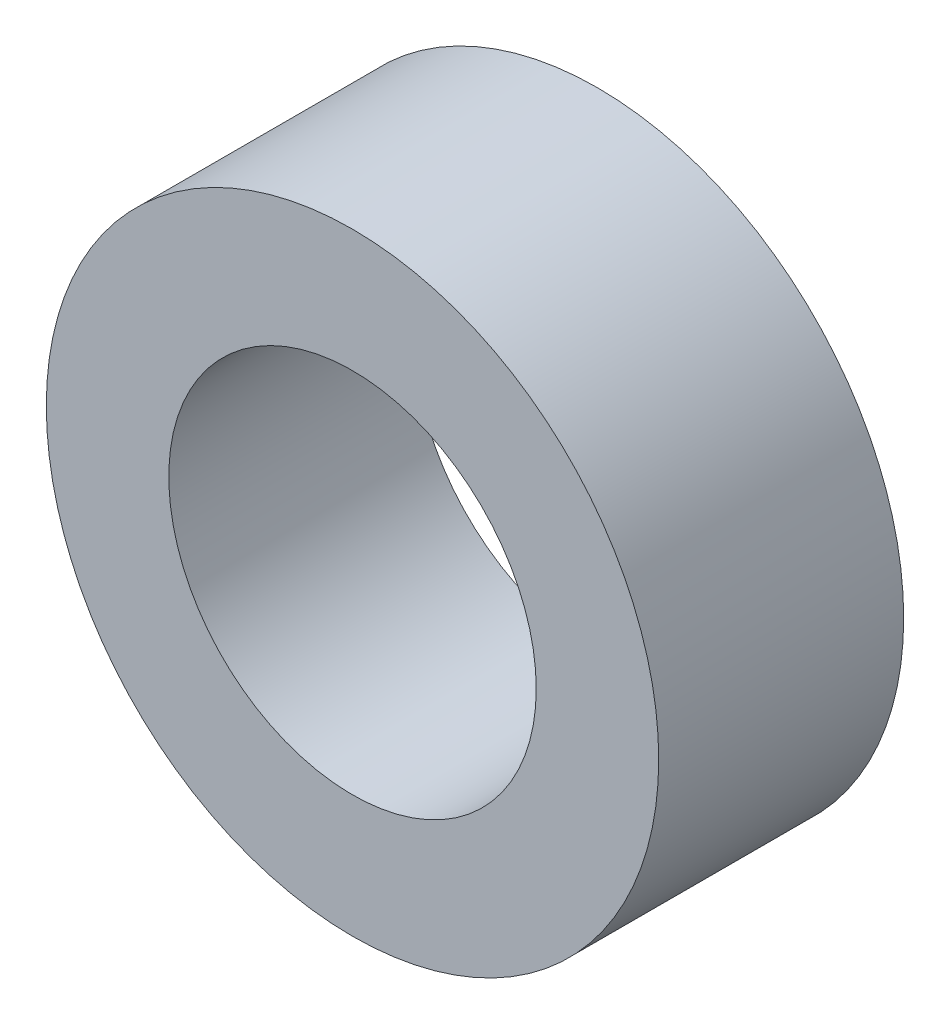
ISO-10303-21;
HEADER;
FILE_DESCRIPTION(('STEP AP214'),'2;1');
FILE_NAME('part.step','',(''),(''),'','','');
FILE_SCHEMA(('AUTOMOTIVE_DESIGN { 1 0 10303 214 1 1 1 1 }'));
ENDSEC;
DATA;
#1=APPLICATION_CONTEXT('core data for automotive mechanical design processes');
#2=APPLICATION_PROTOCOL_DEFINITION('international standard','automotive_design',2000,#1);
#3=PRODUCT_CONTEXT('',#1,'mechanical');
#4=PRODUCT('Part','Part','',(#3));
#5=PRODUCT_RELATED_PRODUCT_CATEGORY('part','',(#4));
#6=PRODUCT_DEFINITION_FORMATION('','',#4);
#7=PRODUCT_DEFINITION_CONTEXT('part definition',#1,'design');
#8=PRODUCT_DEFINITION('design','',#6,#7);
#9=PRODUCT_DEFINITION_SHAPE('','',#8);
#10=(LENGTH_UNIT() NAMED_UNIT(*) SI_UNIT(.MILLI.,.METRE.));
#11=(NAMED_UNIT(*) PLANE_ANGLE_UNIT() SI_UNIT($,.RADIAN.));
#12=(NAMED_UNIT(*) SI_UNIT($,.STERADIAN.) SOLID_ANGLE_UNIT());
#13=UNCERTAINTY_MEASURE_WITH_UNIT(LENGTH_MEASURE(1.E-05),#10,'distance_accuracy_value','');
#14=(GEOMETRIC_REPRESENTATION_CONTEXT(3) GLOBAL_UNCERTAINTY_ASSIGNED_CONTEXT((#13)) GLOBAL_UNIT_ASSIGNED_CONTEXT((#10,
#11,#12)) REPRESENTATION_CONTEXT('',''));
#15=CARTESIAN_POINT('',(0.,0.,0.));
#16=DIRECTION('',(0.,0.,1.));
#17=DIRECTION('',(1.,0.,0.));
#18=AXIS2_PLACEMENT_3D('',#15,#16,#17);
#19=CARTESIAN_POINT('',(0.,0.,3.175));
#20=DIRECTION('',(0.,0.,1.));
#21=DIRECTION('',(1.,0.,0.));
#22=AXIS2_PLACEMENT_3D('',#19,#20,#21);
#23=PLANE('',#22);
#24=CARTESIAN_POINT('',(0.,0.,3.175));
#25=DIRECTION('',(0.,0.,1.));
#26=DIRECTION('',(1.,0.,0.));
#27=AXIS2_PLACEMENT_3D('',#24,#25,#26);
#28=CIRCLE('',#27,3.96875);
#29=CARTESIAN_POINT('',(3.96875,0.,3.175));
#30=VERTEX_POINT('',#29);
#31=EDGE_CURVE('E10',#30,#30,#28,.T.);
#32=ORIENTED_EDGE('',*,*,#31,.T.);
#33=EDGE_LOOP('',(#32));
#34=FACE_BOUND('',#33,.T.);
#35=CARTESIAN_POINT('',(0.,0.,3.175));
#36=DIRECTION('',(0.,0.,1.));
#37=DIRECTION('',(1.,0.,0.));
#38=AXIS2_PLACEMENT_3D('',#35,#36,#37);
#39=CIRCLE('',#38,2.38125);
#40=CARTESIAN_POINT('',(2.38125,0.,3.175));
#41=VERTEX_POINT('',#40);
#42=EDGE_CURVE('E50',#41,#41,#39,.T.);
#43=ORIENTED_EDGE('',*,*,#42,.F.);
#44=EDGE_LOOP('',(#43));
#45=FACE_BOUND('',#44,.T.);
#46=ADVANCED_FACE('F37',(#34,#45),#23,.T.);
#47=CARTESIAN_POINT('',(0.,0.,0.));
#48=DIRECTION('',(0.,0.,1.));
#49=DIRECTION('',(1.,0.,0.));
#50=AXIS2_PLACEMENT_3D('',#47,#48,#49);
#51=PLANE('',#50);
#52=CARTESIAN_POINT('',(0.,0.,0.));
#53=DIRECTION('',(0.,0.,1.));
#54=DIRECTION('',(1.,0.,0.));
#55=AXIS2_PLACEMENT_3D('',#52,#53,#54);
#56=CIRCLE('',#55,3.96875);
#57=CARTESIAN_POINT('',(3.96875,0.,0.));
#58=VERTEX_POINT('',#57);
#59=EDGE_CURVE('E41',#58,#58,#56,.T.);
#60=ORIENTED_EDGE('',*,*,#59,.F.);
#61=EDGE_LOOP('',(#60));
#62=FACE_BOUND('',#61,.T.);
#63=CARTESIAN_POINT('',(0.,0.,0.));
#64=DIRECTION('',(0.,0.,1.));
#65=DIRECTION('',(1.,0.,0.));
#66=AXIS2_PLACEMENT_3D('',#63,#64,#65);
#67=CIRCLE('',#66,2.38125);
#68=CARTESIAN_POINT('',(2.38125,0.,0.));
#69=VERTEX_POINT('',#68);
#70=EDGE_CURVE('E52',#69,#69,#67,.T.);
#71=ORIENTED_EDGE('',*,*,#70,.T.);
#72=EDGE_LOOP('',(#71));
#73=FACE_BOUND('',#72,.T.);
#74=ADVANCED_FACE('F64',(#62,#73),#51,.F.);
#75=CARTESIAN_POINT('',(0.,0.,3.175));
#76=DIRECTION('',(0.,0.,-1.));
#77=DIRECTION('',(-1.,0.,0.));
#78=AXIS2_PLACEMENT_3D('',#75,#76,#77);
#79=CYLINDRICAL_SURFACE('',#78,3.96875);
#80=ORIENTED_EDGE('',*,*,#31,.F.);
#81=EDGE_LOOP('',(#80));
#82=FACE_BOUND('',#81,.T.);
#83=ORIENTED_EDGE('',*,*,#59,.T.);
#84=EDGE_LOOP('',(#83));
#85=FACE_BOUND('',#84,.T.);
#86=ADVANCED_FACE('F39',(#82,#85),#79,.T.);
#87=CARTESIAN_POINT('',(0.,0.,3.175));
#88=DIRECTION('',(0.,0.,-1.));
#89=DIRECTION('',(-1.,0.,0.));
#90=AXIS2_PLACEMENT_3D('',#87,#88,#89);
#91=CYLINDRICAL_SURFACE('',#90,2.38125);
#92=ORIENTED_EDGE('',*,*,#42,.T.);
#93=EDGE_LOOP('',(#92));
#94=FACE_BOUND('',#93,.T.);
#95=ORIENTED_EDGE('',*,*,#70,.F.);
#96=EDGE_LOOP('',(#95));
#97=FACE_BOUND('',#96,.T.);
#98=ADVANCED_FACE('F60',(#94,#97),#91,.F.);
#99=CLOSED_SHELL('',(#46,#74,#86,#98));
#100=MANIFOLD_SOLID_BREP('B2',#99);
#101=ADVANCED_BREP_SHAPE_REPRESENTATION('',(#18,#100),#14);
#102=SHAPE_DEFINITION_REPRESENTATION(#9,#101);
ENDSEC;
END-ISO-10303-21;
